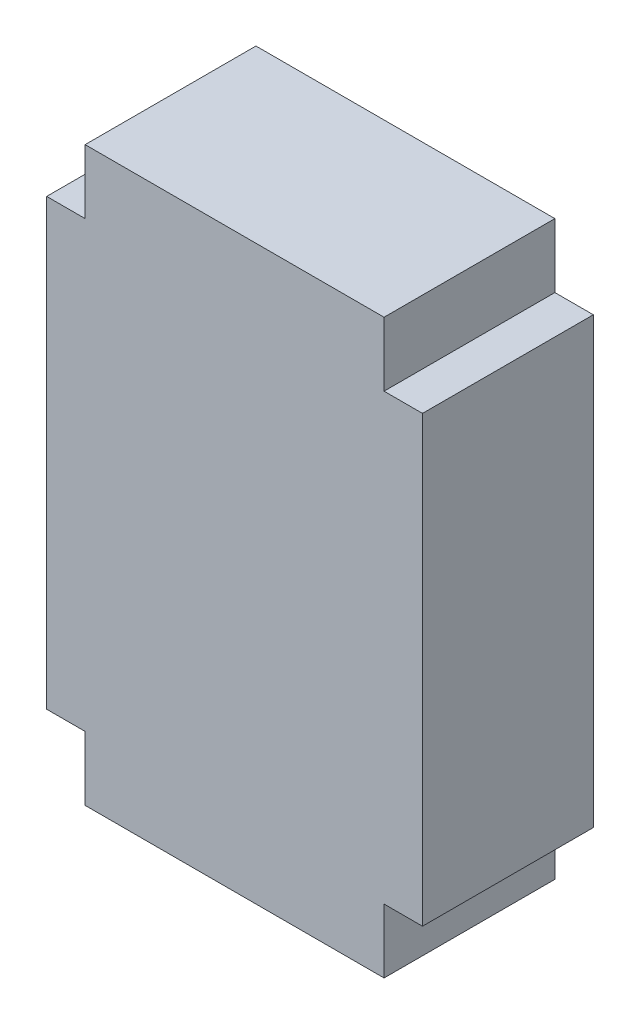
ISO-10303-21;
HEADER;
FILE_DESCRIPTION(('STEP AP214'),'2;1');
FILE_NAME('part.step','',(''),(''),'','','');
FILE_SCHEMA(('AUTOMOTIVE_DESIGN { 1 0 10303 214 1 1 1 1 }'));
ENDSEC;
DATA;
#1=APPLICATION_CONTEXT('core data for automotive mechanical design processes');
#2=APPLICATION_PROTOCOL_DEFINITION('international standard','automotive_design',2000,#1);
#3=PRODUCT_CONTEXT('',#1,'mechanical');
#4=PRODUCT('Part','Part','',(#3));
#5=PRODUCT_RELATED_PRODUCT_CATEGORY('part','',(#4));
#6=PRODUCT_DEFINITION_FORMATION('','',#4);
#7=PRODUCT_DEFINITION_CONTEXT('part definition',#1,'design');
#8=PRODUCT_DEFINITION('design','',#6,#7);
#9=PRODUCT_DEFINITION_SHAPE('','',#8);
#10=(LENGTH_UNIT() NAMED_UNIT(*) SI_UNIT(.MILLI.,.METRE.));
#11=(NAMED_UNIT(*) PLANE_ANGLE_UNIT() SI_UNIT($,.RADIAN.));
#12=(NAMED_UNIT(*) SI_UNIT($,.STERADIAN.) SOLID_ANGLE_UNIT());
#13=UNCERTAINTY_MEASURE_WITH_UNIT(LENGTH_MEASURE(1.E-05),#10,'distance_accuracy_value','');
#14=(GEOMETRIC_REPRESENTATION_CONTEXT(3) GLOBAL_UNCERTAINTY_ASSIGNED_CONTEXT((#13)) GLOBAL_UNIT_ASSIGNED_CONTEXT((#10,
#11,#12)) REPRESENTATION_CONTEXT('',''));
#15=CARTESIAN_POINT('',(0.,0.,0.));
#16=DIRECTION('',(0.,0.,1.));
#17=DIRECTION('',(1.,0.,0.));
#18=AXIS2_PLACEMENT_3D('',#15,#16,#17);
#19=CARTESIAN_POINT('',(-1.1,-1.3,1.));
#20=DIRECTION('',(1.,0.,0.));
#21=DIRECTION('',(0.,0.,-1.));
#22=AXIS2_PLACEMENT_3D('',#19,#20,#21);
#23=PLANE('',#22);
#24=DIRECTION('',(0.,-1.,0.));
#25=VECTOR('',#24,1.);
#26=CARTESIAN_POINT('',(-1.1,-1.3,0.));
#27=LINE('',#26,#25);
#28=CARTESIAN_POINT('',(-1.1,1.3,0.));
#29=VERTEX_POINT('',#28);
#30=CARTESIAN_POINT('',(-1.1,-1.3,0.));
#31=VERTEX_POINT('',#30);
#32=EDGE_CURVE('E154',#29,#31,#27,.T.);
#33=ORIENTED_EDGE('',*,*,#32,.T.);
#34=DIRECTION('',(0.,0.,-1.));
#35=VECTOR('',#34,1.);
#36=CARTESIAN_POINT('',(-1.1,-1.3,1.));
#37=LINE('',#36,#35);
#38=CARTESIAN_POINT('',(-1.1,-1.3,1.));
#39=VERTEX_POINT('',#38);
#40=EDGE_CURVE('E11',#39,#31,#37,.T.);
#41=ORIENTED_EDGE('',*,*,#40,.F.);
#42=DIRECTION('',(0.,-1.,0.));
#43=VECTOR('',#42,1.);
#44=CARTESIAN_POINT('',(-1.1,-1.3,1.));
#45=LINE('',#44,#43);
#46=CARTESIAN_POINT('',(-1.1,1.3,1.));
#47=VERTEX_POINT('',#46);
#48=EDGE_CURVE('E176',#47,#39,#45,.T.);
#49=ORIENTED_EDGE('',*,*,#48,.F.);
#50=DIRECTION('',(0.,0.,-1.));
#51=VECTOR('',#50,1.);
#52=CARTESIAN_POINT('',(-1.1,1.3,1.));
#53=LINE('',#52,#51);
#54=EDGE_CURVE('E150',#47,#29,#53,.T.);
#55=ORIENTED_EDGE('',*,*,#54,.T.);
#56=EDGE_LOOP('',(#33,#41,#49,#55));
#57=FACE_BOUND('',#56,.T.);
#58=ADVANCED_FACE('F34',(#57),#23,.F.);
#59=CARTESIAN_POINT('',(-0.875,-1.3,1.));
#60=DIRECTION('',(0.,1.,0.));
#61=DIRECTION('',(0.,0.,1.));
#62=AXIS2_PLACEMENT_3D('',#59,#60,#61);
#63=PLANE('',#62);
#64=DIRECTION('',(1.,0.,0.));
#65=VECTOR('',#64,1.);
#66=CARTESIAN_POINT('',(-0.875,-1.3,0.));
#67=LINE('',#66,#65);
#68=CARTESIAN_POINT('',(-0.875,-1.3,0.));
#69=VERTEX_POINT('',#68);
#70=EDGE_CURVE('E157',#31,#69,#67,.T.);
#71=ORIENTED_EDGE('',*,*,#70,.T.);
#72=DIRECTION('',(0.,0.,-1.));
#73=VECTOR('',#72,1.);
#74=CARTESIAN_POINT('',(-0.875,-1.3,1.));
#75=LINE('',#74,#73);
#76=CARTESIAN_POINT('',(-0.875,-1.3,1.));
#77=VERTEX_POINT('',#76);
#78=EDGE_CURVE('E42',#77,#69,#75,.T.);
#79=ORIENTED_EDGE('',*,*,#78,.F.);
#80=DIRECTION('',(1.,0.,0.));
#81=VECTOR('',#80,1.);
#82=CARTESIAN_POINT('',(-0.875,-1.3,1.));
#83=LINE('',#82,#81);
#84=EDGE_CURVE('E105',#39,#77,#83,.T.);
#85=ORIENTED_EDGE('',*,*,#84,.F.);
#86=ORIENTED_EDGE('',*,*,#40,.T.);
#87=EDGE_LOOP('',(#71,#79,#85,#86));
#88=FACE_BOUND('',#87,.T.);
#89=ADVANCED_FACE('F254',(#88),#63,.F.);
#90=CARTESIAN_POINT('',(-0.875,-1.675,1.));
#91=DIRECTION('',(1.,0.,0.));
#92=DIRECTION('',(0.,0.,-1.));
#93=AXIS2_PLACEMENT_3D('',#90,#91,#92);
#94=PLANE('',#93);
#95=DIRECTION('',(0.,-1.,0.));
#96=VECTOR('',#95,1.);
#97=CARTESIAN_POINT('',(-0.875,-1.675,0.));
#98=LINE('',#97,#96);
#99=CARTESIAN_POINT('',(-0.875,-1.675,0.));
#100=VERTEX_POINT('',#99);
#101=EDGE_CURVE('E159',#69,#100,#98,.T.);
#102=ORIENTED_EDGE('',*,*,#101,.T.);
#103=DIRECTION('',(0.,0.,-1.));
#104=VECTOR('',#103,1.);
#105=CARTESIAN_POINT('',(-0.875,-1.675,1.));
#106=LINE('',#105,#104);
#107=CARTESIAN_POINT('',(-0.875,-1.675,1.));
#108=VERTEX_POINT('',#107);
#109=EDGE_CURVE('E195',#108,#100,#106,.T.);
#110=ORIENTED_EDGE('',*,*,#109,.F.);
#111=DIRECTION('',(0.,-1.,0.));
#112=VECTOR('',#111,1.);
#113=CARTESIAN_POINT('',(-0.875,-1.675,1.));
#114=LINE('',#113,#112);
#115=EDGE_CURVE('E203',#77,#108,#114,.T.);
#116=ORIENTED_EDGE('',*,*,#115,.F.);
#117=ORIENTED_EDGE('',*,*,#78,.T.);
#118=EDGE_LOOP('',(#102,#110,#116,#117));
#119=FACE_BOUND('',#118,.T.);
#120=ADVANCED_FACE('F201',(#119),#94,.F.);
#121=CARTESIAN_POINT('',(0.875,-1.675,1.));
#122=DIRECTION('',(0.,1.,0.));
#123=DIRECTION('',(0.,0.,1.));
#124=AXIS2_PLACEMENT_3D('',#121,#122,#123);
#125=PLANE('',#124);
#126=DIRECTION('',(1.,0.,0.));
#127=VECTOR('',#126,1.);
#128=CARTESIAN_POINT('',(0.875,-1.675,0.));
#129=LINE('',#128,#127);
#130=CARTESIAN_POINT('',(0.875,-1.675,0.));
#131=VERTEX_POINT('',#130);
#132=EDGE_CURVE('E161',#100,#131,#129,.T.);
#133=ORIENTED_EDGE('',*,*,#132,.T.);
#134=DIRECTION('',(0.,0.,-1.));
#135=VECTOR('',#134,1.);
#136=CARTESIAN_POINT('',(0.875,-1.675,1.));
#137=LINE('',#136,#135);
#138=CARTESIAN_POINT('',(0.875,-1.675,1.));
#139=VERTEX_POINT('',#138);
#140=EDGE_CURVE('E192',#139,#131,#137,.T.);
#141=ORIENTED_EDGE('',*,*,#140,.F.);
#142=DIRECTION('',(1.,0.,0.));
#143=VECTOR('',#142,1.);
#144=CARTESIAN_POINT('',(0.875,-1.675,1.));
#145=LINE('',#144,#143);
#146=EDGE_CURVE('E221',#108,#139,#145,.T.);
#147=ORIENTED_EDGE('',*,*,#146,.F.);
#148=ORIENTED_EDGE('',*,*,#109,.T.);
#149=EDGE_LOOP('',(#133,#141,#147,#148));
#150=FACE_BOUND('',#149,.T.);
#151=ADVANCED_FACE('F212',(#150),#125,.F.);
#152=CARTESIAN_POINT('',(0.875,-1.3,1.));
#153=DIRECTION('',(-1.,0.,0.));
#154=DIRECTION('',(0.,0.,1.));
#155=AXIS2_PLACEMENT_3D('',#152,#153,#154);
#156=PLANE('',#155);
#157=DIRECTION('',(0.,1.,0.));
#158=VECTOR('',#157,1.);
#159=CARTESIAN_POINT('',(0.875,-1.3,0.));
#160=LINE('',#159,#158);
#161=CARTESIAN_POINT('',(0.875,-1.3,0.));
#162=VERTEX_POINT('',#161);
#163=EDGE_CURVE('E163',#131,#162,#160,.T.);
#164=ORIENTED_EDGE('',*,*,#163,.T.);
#165=DIRECTION('',(0.,0.,-1.));
#166=VECTOR('',#165,1.);
#167=CARTESIAN_POINT('',(0.875,-1.3,1.));
#168=LINE('',#167,#166);
#169=CARTESIAN_POINT('',(0.875,-1.3,1.));
#170=VERTEX_POINT('',#169);
#171=EDGE_CURVE('E189',#170,#162,#168,.T.);
#172=ORIENTED_EDGE('',*,*,#171,.F.);
#173=DIRECTION('',(0.,1.,0.));
#174=VECTOR('',#173,1.);
#175=CARTESIAN_POINT('',(0.875,-1.3,1.));
#176=LINE('',#175,#174);
#177=EDGE_CURVE('E218',#139,#170,#176,.T.);
#178=ORIENTED_EDGE('',*,*,#177,.F.);
#179=ORIENTED_EDGE('',*,*,#140,.T.);
#180=EDGE_LOOP('',(#164,#172,#178,#179));
#181=FACE_BOUND('',#180,.T.);
#182=ADVANCED_FACE('F216',(#181),#156,.F.);
#183=CARTESIAN_POINT('',(1.1,-1.3,1.));
#184=DIRECTION('',(0.,1.,0.));
#185=DIRECTION('',(0.,0.,1.));
#186=AXIS2_PLACEMENT_3D('',#183,#184,#185);
#187=PLANE('',#186);
#188=DIRECTION('',(1.,0.,0.));
#189=VECTOR('',#188,1.);
#190=CARTESIAN_POINT('',(1.1,-1.3,0.));
#191=LINE('',#190,#189);
#192=CARTESIAN_POINT('',(1.1,-1.3,0.));
#193=VERTEX_POINT('',#192);
#194=EDGE_CURVE('E165',#162,#193,#191,.T.);
#195=ORIENTED_EDGE('',*,*,#194,.T.);
#196=DIRECTION('',(0.,0.,-1.));
#197=VECTOR('',#196,1.);
#198=CARTESIAN_POINT('',(1.1,-1.3,1.));
#199=LINE('',#198,#197);
#200=CARTESIAN_POINT('',(1.1,-1.3,1.));
#201=VERTEX_POINT('',#200);
#202=EDGE_CURVE('E186',#201,#193,#199,.T.);
#203=ORIENTED_EDGE('',*,*,#202,.F.);
#204=DIRECTION('',(1.,0.,0.));
#205=VECTOR('',#204,1.);
#206=CARTESIAN_POINT('',(1.1,-1.3,1.));
#207=LINE('',#206,#205);
#208=EDGE_CURVE('E220',#170,#201,#207,.T.);
#209=ORIENTED_EDGE('',*,*,#208,.F.);
#210=ORIENTED_EDGE('',*,*,#171,.T.);
#211=EDGE_LOOP('',(#195,#203,#209,#210));
#212=FACE_BOUND('',#211,.T.);
#213=ADVANCED_FACE('F267',(#212),#187,.F.);
#214=CARTESIAN_POINT('',(1.1,1.3,1.));
#215=DIRECTION('',(-1.,0.,0.));
#216=DIRECTION('',(0.,0.,1.));
#217=AXIS2_PLACEMENT_3D('',#214,#215,#216);
#218=PLANE('',#217);
#219=DIRECTION('',(0.,1.,0.));
#220=VECTOR('',#219,1.);
#221=CARTESIAN_POINT('',(1.1,1.3,0.));
#222=LINE('',#221,#220);
#223=CARTESIAN_POINT('',(1.1,1.3,0.));
#224=VERTEX_POINT('',#223);
#225=EDGE_CURVE('E167',#193,#224,#222,.T.);
#226=ORIENTED_EDGE('',*,*,#225,.T.);
#227=DIRECTION('',(0.,0.,-1.));
#228=VECTOR('',#227,1.);
#229=CARTESIAN_POINT('',(1.1,1.3,1.));
#230=LINE('',#229,#228);
#231=CARTESIAN_POINT('',(1.1,1.3,1.));
#232=VERTEX_POINT('',#231);
#233=EDGE_CURVE('E183',#232,#224,#230,.T.);
#234=ORIENTED_EDGE('',*,*,#233,.F.);
#235=DIRECTION('',(0.,1.,0.));
#236=VECTOR('',#235,1.);
#237=CARTESIAN_POINT('',(1.1,1.3,1.));
#238=LINE('',#237,#236);
#239=EDGE_CURVE('E223',#201,#232,#238,.T.);
#240=ORIENTED_EDGE('',*,*,#239,.F.);
#241=ORIENTED_EDGE('',*,*,#202,.T.);
#242=EDGE_LOOP('',(#226,#234,#240,#241));
#243=FACE_BOUND('',#242,.T.);
#244=ADVANCED_FACE('F270',(#243),#218,.F.);
#245=CARTESIAN_POINT('',(0.875,1.3,1.));
#246=DIRECTION('',(0.,-1.,0.));
#247=DIRECTION('',(0.,0.,-1.));
#248=AXIS2_PLACEMENT_3D('',#245,#246,#247);
#249=PLANE('',#248);
#250=DIRECTION('',(-1.,0.,0.));
#251=VECTOR('',#250,1.);
#252=CARTESIAN_POINT('',(0.875,1.3,0.));
#253=LINE('',#252,#251);
#254=CARTESIAN_POINT('',(0.875,1.3,0.));
#255=VERTEX_POINT('',#254);
#256=EDGE_CURVE('E169',#224,#255,#253,.T.);
#257=ORIENTED_EDGE('',*,*,#256,.T.);
#258=DIRECTION('',(0.,0.,-1.));
#259=VECTOR('',#258,1.);
#260=CARTESIAN_POINT('',(0.875,1.3,1.));
#261=LINE('',#260,#259);
#262=CARTESIAN_POINT('',(0.875,1.3,1.));
#263=VERTEX_POINT('',#262);
#264=EDGE_CURVE('E180',#263,#255,#261,.T.);
#265=ORIENTED_EDGE('',*,*,#264,.F.);
#266=DIRECTION('',(-1.,0.,0.));
#267=VECTOR('',#266,1.);
#268=CARTESIAN_POINT('',(0.875,1.3,1.));
#269=LINE('',#268,#267);
#270=EDGE_CURVE('E229',#232,#263,#269,.T.);
#271=ORIENTED_EDGE('',*,*,#270,.F.);
#272=ORIENTED_EDGE('',*,*,#233,.T.);
#273=EDGE_LOOP('',(#257,#265,#271,#272));
#274=FACE_BOUND('',#273,.T.);
#275=ADVANCED_FACE('F235',(#274),#249,.F.);
#276=CARTESIAN_POINT('',(0.875,1.675,1.));
#277=DIRECTION('',(-1.,0.,0.));
#278=DIRECTION('',(0.,0.,1.));
#279=AXIS2_PLACEMENT_3D('',#276,#277,#278);
#280=PLANE('',#279);
#281=DIRECTION('',(0.,1.,0.));
#282=VECTOR('',#281,1.);
#283=CARTESIAN_POINT('',(0.875,1.675,0.));
#284=LINE('',#283,#282);
#285=CARTESIAN_POINT('',(0.875,1.675,0.));
#286=VERTEX_POINT('',#285);
#287=EDGE_CURVE('E171',#255,#286,#284,.T.);
#288=ORIENTED_EDGE('',*,*,#287,.T.);
#289=DIRECTION('',(0.,0.,-1.));
#290=VECTOR('',#289,1.);
#291=CARTESIAN_POINT('',(0.875,1.675,1.));
#292=LINE('',#291,#290);
#293=CARTESIAN_POINT('',(0.875,1.675,1.));
#294=VERTEX_POINT('',#293);
#295=EDGE_CURVE('E145',#294,#286,#292,.T.);
#296=ORIENTED_EDGE('',*,*,#295,.F.);
#297=DIRECTION('',(0.,1.,0.));
#298=VECTOR('',#297,1.);
#299=CARTESIAN_POINT('',(0.875,1.675,1.));
#300=LINE('',#299,#298);
#301=EDGE_CURVE('E136',#263,#294,#300,.T.);
#302=ORIENTED_EDGE('',*,*,#301,.F.);
#303=ORIENTED_EDGE('',*,*,#264,.T.);
#304=EDGE_LOOP('',(#288,#296,#302,#303));
#305=FACE_BOUND('',#304,.T.);
#306=ADVANCED_FACE('F239',(#305),#280,.F.);
#307=CARTESIAN_POINT('',(-0.875,1.675,1.));
#308=DIRECTION('',(0.,-1.,0.));
#309=DIRECTION('',(0.,0.,-1.));
#310=AXIS2_PLACEMENT_3D('',#307,#308,#309);
#311=PLANE('',#310);
#312=DIRECTION('',(-1.,0.,0.));
#313=VECTOR('',#312,1.);
#314=CARTESIAN_POINT('',(-0.875,1.675,0.));
#315=LINE('',#314,#313);
#316=CARTESIAN_POINT('',(-0.875,1.675,0.));
#317=VERTEX_POINT('',#316);
#318=EDGE_CURVE('E144',#286,#317,#315,.T.);
#319=ORIENTED_EDGE('',*,*,#318,.T.);
#320=DIRECTION('',(0.,0.,-1.));
#321=VECTOR('',#320,1.);
#322=CARTESIAN_POINT('',(-0.875,1.675,1.));
#323=LINE('',#322,#321);
#324=CARTESIAN_POINT('',(-0.875,1.675,1.));
#325=VERTEX_POINT('',#324);
#326=EDGE_CURVE('E141',#325,#317,#323,.T.);
#327=ORIENTED_EDGE('',*,*,#326,.F.);
#328=DIRECTION('',(-1.,0.,0.));
#329=VECTOR('',#328,1.);
#330=CARTESIAN_POINT('',(-0.875,1.675,1.));
#331=LINE('',#330,#329);
#332=EDGE_CURVE('E130',#294,#325,#331,.T.);
#333=ORIENTED_EDGE('',*,*,#332,.F.);
#334=ORIENTED_EDGE('',*,*,#295,.T.);
#335=EDGE_LOOP('',(#319,#327,#333,#334));
#336=FACE_BOUND('',#335,.T.);
#337=ADVANCED_FACE('F142',(#336),#311,.F.);
#338=CARTESIAN_POINT('',(-0.875,1.3,1.));
#339=DIRECTION('',(1.,0.,0.));
#340=DIRECTION('',(0.,0.,-1.));
#341=AXIS2_PLACEMENT_3D('',#338,#339,#340);
#342=PLANE('',#341);
#343=DIRECTION('',(0.,-1.,0.));
#344=VECTOR('',#343,1.);
#345=CARTESIAN_POINT('',(-0.875,1.3,0.));
#346=LINE('',#345,#344);
#347=CARTESIAN_POINT('',(-0.875,1.3,0.));
#348=VERTEX_POINT('',#347);
#349=EDGE_CURVE('E91',#317,#348,#346,.T.);
#350=ORIENTED_EDGE('',*,*,#349,.T.);
#351=DIRECTION('',(0.,0.,-1.));
#352=VECTOR('',#351,1.);
#353=CARTESIAN_POINT('',(-0.875,1.3,1.));
#354=LINE('',#353,#352);
#355=CARTESIAN_POINT('',(-0.875,1.3,1.));
#356=VERTEX_POINT('',#355);
#357=EDGE_CURVE('E146',#356,#348,#354,.T.);
#358=ORIENTED_EDGE('',*,*,#357,.F.);
#359=DIRECTION('',(0.,-1.,0.));
#360=VECTOR('',#359,1.);
#361=CARTESIAN_POINT('',(-0.875,1.3,1.));
#362=LINE('',#361,#360);
#363=EDGE_CURVE('E134',#325,#356,#362,.T.);
#364=ORIENTED_EDGE('',*,*,#363,.F.);
#365=ORIENTED_EDGE('',*,*,#326,.T.);
#366=EDGE_LOOP('',(#350,#358,#364,#365));
#367=FACE_BOUND('',#366,.T.);
#368=ADVANCED_FACE('F148',(#367),#342,.F.);
#369=CARTESIAN_POINT('',(-1.1,1.3,1.));
#370=DIRECTION('',(0.,-1.,0.));
#371=DIRECTION('',(0.,0.,-1.));
#372=AXIS2_PLACEMENT_3D('',#369,#370,#371);
#373=PLANE('',#372);
#374=DIRECTION('',(-1.,0.,0.));
#375=VECTOR('',#374,1.);
#376=CARTESIAN_POINT('',(-1.1,1.3,0.));
#377=LINE('',#376,#375);
#378=EDGE_CURVE('E97',#348,#29,#377,.T.);
#379=ORIENTED_EDGE('',*,*,#378,.T.);
#380=ORIENTED_EDGE('',*,*,#54,.F.);
#381=DIRECTION('',(-1.,0.,0.));
#382=VECTOR('',#381,1.);
#383=CARTESIAN_POINT('',(-1.1,1.3,1.));
#384=LINE('',#383,#382);
#385=EDGE_CURVE('E50',#356,#47,#384,.T.);
#386=ORIENTED_EDGE('',*,*,#385,.F.);
#387=ORIENTED_EDGE('',*,*,#357,.T.);
#388=EDGE_LOOP('',(#379,#380,#386,#387));
#389=FACE_BOUND('',#388,.T.);
#390=ADVANCED_FACE('F243',(#389),#373,.F.);
#391=CARTESIAN_POINT('',(0.,0.,1.));
#392=DIRECTION('',(0.,0.,-1.));
#393=DIRECTION('',(-1.,0.,0.));
#394=AXIS2_PLACEMENT_3D('',#391,#392,#393);
#395=PLANE('',#394);
#396=ORIENTED_EDGE('',*,*,#48,.T.);
#397=ORIENTED_EDGE('',*,*,#84,.T.);
#398=ORIENTED_EDGE('',*,*,#115,.T.);
#399=ORIENTED_EDGE('',*,*,#146,.T.);
#400=ORIENTED_EDGE('',*,*,#177,.T.);
#401=ORIENTED_EDGE('',*,*,#208,.T.);
#402=ORIENTED_EDGE('',*,*,#239,.T.);
#403=ORIENTED_EDGE('',*,*,#270,.T.);
#404=ORIENTED_EDGE('',*,*,#301,.T.);
#405=ORIENTED_EDGE('',*,*,#332,.T.);
#406=ORIENTED_EDGE('',*,*,#363,.T.);
#407=ORIENTED_EDGE('',*,*,#385,.T.);
#408=EDGE_LOOP('',(#396,#397,#398,#399,#400,#401,#402,#403,#404,#405,#406,#407));
#409=FACE_BOUND('',#408,.T.);
#410=ADVANCED_FACE('F132',(#409),#395,.F.);
#411=CARTESIAN_POINT('',(0.,0.,0.));
#412=DIRECTION('',(0.,0.,-1.));
#413=DIRECTION('',(-1.,0.,0.));
#414=AXIS2_PLACEMENT_3D('',#411,#412,#413);
#415=PLANE('',#414);
#416=ORIENTED_EDGE('',*,*,#32,.F.);
#417=ORIENTED_EDGE('',*,*,#378,.F.);
#418=ORIENTED_EDGE('',*,*,#349,.F.);
#419=ORIENTED_EDGE('',*,*,#318,.F.);
#420=ORIENTED_EDGE('',*,*,#287,.F.);
#421=ORIENTED_EDGE('',*,*,#256,.F.);
#422=ORIENTED_EDGE('',*,*,#225,.F.);
#423=ORIENTED_EDGE('',*,*,#194,.F.);
#424=ORIENTED_EDGE('',*,*,#163,.F.);
#425=ORIENTED_EDGE('',*,*,#132,.F.);
#426=ORIENTED_EDGE('',*,*,#101,.F.);
#427=ORIENTED_EDGE('',*,*,#70,.F.);
#428=EDGE_LOOP('',(#416,#417,#418,#419,#420,#421,#422,#423,#424,#425,#426,#427));
#429=FACE_BOUND('',#428,.T.);
#430=ADVANCED_FACE('F207',(#429),#415,.T.);
#431=CLOSED_SHELL('',(#58,#89,#120,#151,#182,#213,#244,#275,#306,#337,#368,#390,#410,#430));
#432=MANIFOLD_SOLID_BREP('B2',#431);
#433=ADVANCED_BREP_SHAPE_REPRESENTATION('',(#18,#432),#14);
#434=SHAPE_DEFINITION_REPRESENTATION(#9,#433);
ENDSEC;
END-ISO-10303-21;
